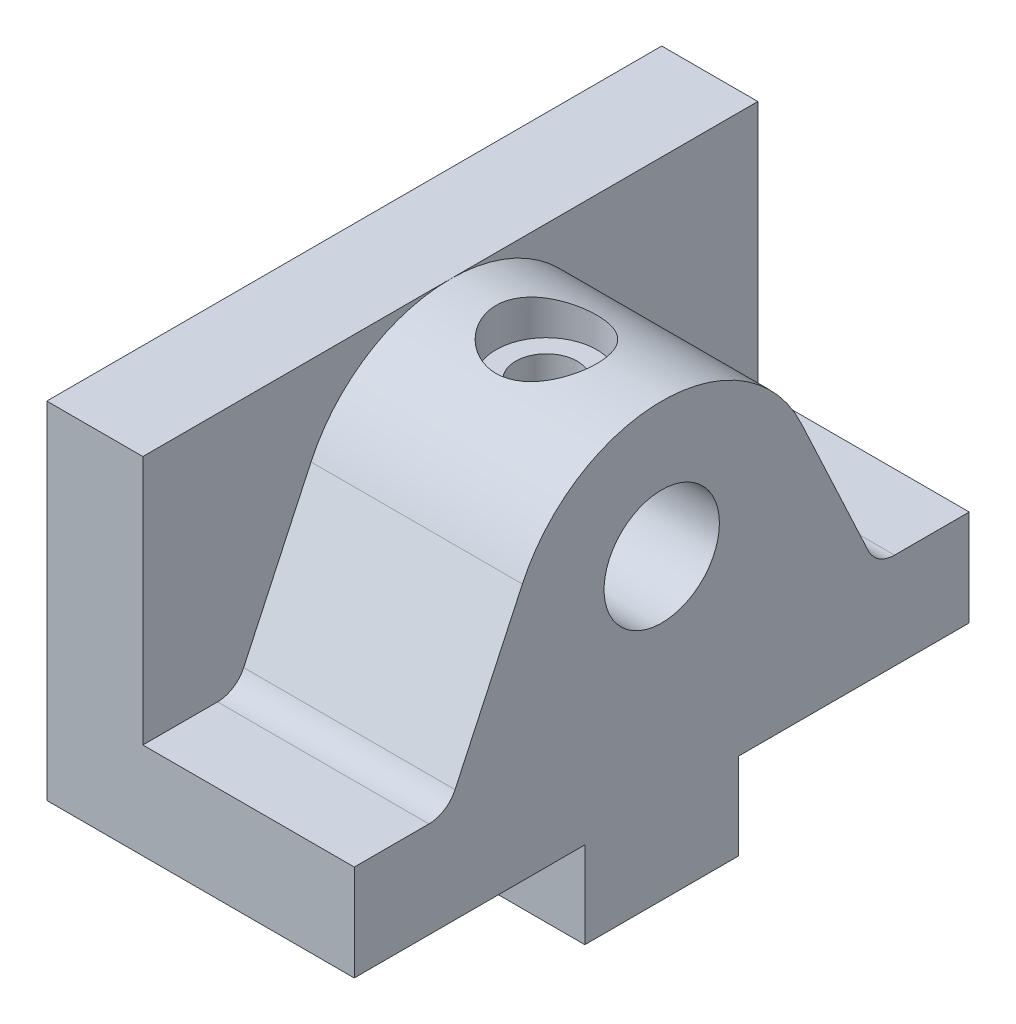
ISO-10303-21;
HEADER;
FILE_DESCRIPTION(('STEP AP214'),'2;1');
FILE_NAME('part.step','',(''),(''),'','','');
FILE_SCHEMA(('AUTOMOTIVE_DESIGN { 1 0 10303 214 1 1 1 1 }'));
ENDSEC;
DATA;
#1=APPLICATION_CONTEXT('core data for automotive mechanical design processes');
#2=APPLICATION_PROTOCOL_DEFINITION('international standard','automotive_design',2000,#1);
#3=PRODUCT_CONTEXT('',#1,'mechanical');
#4=PRODUCT('Part','Part','',(#3));
#5=PRODUCT_RELATED_PRODUCT_CATEGORY('part','',(#4));
#6=PRODUCT_DEFINITION_FORMATION('','',#4);
#7=PRODUCT_DEFINITION_CONTEXT('part definition',#1,'design');
#8=PRODUCT_DEFINITION('design','',#6,#7);
#9=PRODUCT_DEFINITION_SHAPE('','',#8);
#10=(LENGTH_UNIT() NAMED_UNIT(*) SI_UNIT(.MILLI.,.METRE.));
#11=(NAMED_UNIT(*) PLANE_ANGLE_UNIT() SI_UNIT($,.RADIAN.));
#12=(NAMED_UNIT(*) SI_UNIT($,.STERADIAN.) SOLID_ANGLE_UNIT());
#13=UNCERTAINTY_MEASURE_WITH_UNIT(LENGTH_MEASURE(1.E-05),#10,'distance_accuracy_value','');
#14=(GEOMETRIC_REPRESENTATION_CONTEXT(3) GLOBAL_UNCERTAINTY_ASSIGNED_CONTEXT((#13)) GLOBAL_UNIT_ASSIGNED_CONTEXT((#10,
#11,#12)) REPRESENTATION_CONTEXT('',''));
#15=CARTESIAN_POINT('',(0.,0.,0.));
#16=DIRECTION('',(0.,0.,1.));
#17=DIRECTION('',(1.,0.,0.));
#18=AXIS2_PLACEMENT_3D('',#15,#16,#17);
#19=CARTESIAN_POINT('',(32.,29.,0.));
#20=DIRECTION('',(-1.,0.,0.));
#21=DIRECTION('',(0.,0.,1.));
#22=AXIS2_PLACEMENT_3D('',#19,#20,#21);
#23=CYLINDRICAL_SURFACE('',#22,16.);
#24=CARTESIAN_POINT('',(20.,44.1141490001918,5.25));
#25=CARTESIAN_POINT('',(20.2862399912378,44.1141488277864,5.25000045848222));
#26=CARTESIAN_POINT('',(20.5724790069683,44.1223693526665,5.22651124120608));
#27=CARTESIAN_POINT('',(21.1364949318347,44.1541990111532,5.13347949667015));
#28=CARTESIAN_POINT('',(21.4142702153212,44.17781108179,5.06392817975404));
#29=CARTESIAN_POINT('',(21.9530997868456,44.2374676598123,4.88146368966989));
#30=CARTESIAN_POINT('',(22.2141849176572,44.2734883998512,4.76863336580666));
#31=CARTESIAN_POINT('',(22.7138017635542,44.3538695126229,4.50309502153799));
#32=CARTESIAN_POINT('',(22.9523287324993,44.3982316345059,4.35037863458794));
#33=CARTESIAN_POINT('',(23.4090988821987,44.4921827252159,4.00320337483453));
#34=CARTESIAN_POINT('',(23.6263621147882,44.5418989966284,3.80748934488802));
#35=CARTESIAN_POINT('',(24.0256483131268,44.6398787520157,3.38255491200123));
#36=CARTESIAN_POINT('',(24.2076658151615,44.6881420097698,3.15332932382409));
#37=CARTESIAN_POINT('',(24.5357088642128,44.7792471777439,2.66074424250728));
#38=CARTESIAN_POINT('',(24.6807121346096,44.8219218746451,2.3966702969027));
#39=CARTESIAN_POINT('',(24.9238550635939,44.8955450974396,1.84624013913086));
#40=CARTESIAN_POINT('',(25.0220069363935,44.9264966791274,1.55988975712002));
#41=CARTESIAN_POINT('',(25.165350860901,44.9722847158495,0.983306157529007));
#42=CARTESIAN_POINT('',(25.2122206628969,44.9876304536975,0.693531238138871));
#43=CARTESIAN_POINT('',(25.2569998107175,45.0022832276952,0.109850799627945));
#44=CARTESIAN_POINT('',(25.2549213939875,45.0015942726466,-0.184053668709217));
#45=CARTESIAN_POINT('',(25.2029373758687,44.9846028308919,-0.75579215660497));
#46=CARTESIAN_POINT('',(25.1548531678085,44.9688949663536,-1.03381232980338));
#47=CARTESIAN_POINT('',(25.0152285393295,44.9243733193102,-1.57759305294689));
#48=CARTESIAN_POINT('',(24.9236851984931,44.8955586560445,-1.84335277768305));
#49=CARTESIAN_POINT('',(24.6986504931013,44.827293412727,-2.35910715243038));
#50=CARTESIAN_POINT('',(24.5646321050164,44.7877101425793,-2.60885356318651));
#51=CARTESIAN_POINT('',(24.2588828999032,44.7020408419918,-3.08285821657604));
#52=CARTESIAN_POINT('',(24.0871418288635,44.6559530446716,-3.30710950376656));
#53=CARTESIAN_POINT('',(23.701599361394,44.5596588378374,-3.734600144692));
#54=CARTESIAN_POINT('',(23.4862342741626,44.5093604624126,-3.93641057040518));
#55=CARTESIAN_POINT('',(23.0242779746565,44.4121008511626,-4.30150362318824));
#56=CARTESIAN_POINT('',(22.7776822633624,44.365140097673,-4.46478068949822));
#57=CARTESIAN_POINT('',(22.2558627499943,44.2793792690122,-4.75006815697089));
#58=CARTESIAN_POINT('',(21.9802988274958,44.2406973142269,-4.87149464345703));
#59=CARTESIAN_POINT('',(21.4110500224792,44.1772455296613,-5.06574607230722));
#60=CARTESIAN_POINT('',(21.1173725057812,44.1524700857144,-5.13859062981242));
#61=CARTESIAN_POINT('',(20.5340362613495,44.1209007206699,-5.23074027258799));
#62=CARTESIAN_POINT('',(20.244766428925,44.1133656363251,-5.25225392788164));
#63=CARTESIAN_POINT('',(19.6667114449849,44.1150619799214,-5.24737291521556));
#64=CARTESIAN_POINT('',(19.3779262177028,44.124290482417,-5.22098660637017));
#65=CARTESIAN_POINT('',(18.8189455397546,44.1577370929003,-5.1230365564249));
#66=CARTESIAN_POINT('',(18.5484510805595,44.1814516414274,-5.05298895415494));
#67=CARTESIAN_POINT('',(18.0231029282508,44.2406495676964,-4.87151396022818));
#68=CARTESIAN_POINT('',(17.7682519619801,44.276134990374,-4.76007937807277));
#69=CARTESIAN_POINT('',(17.2726831888759,44.3562378094073,-4.4950678329135));
#70=CARTESIAN_POINT('',(17.0326473205719,44.4011039403221,-4.34029284144107));
#71=CARTESIAN_POINT('',(16.5811543923619,44.4944220870633,-3.99436200821794));
#72=CARTESIAN_POINT('',(16.3697055340331,44.5428751258249,-3.80319576358278));
#73=CARTESIAN_POINT('',(15.9712565423561,44.6406265983864,-3.37937404629902));
#74=CARTESIAN_POINT('',(15.785845431176,44.6898599940428,-3.14520539148217));
#75=CARTESIAN_POINT('',(15.4568575354208,44.7814007265402,-2.64787225955551));
#76=CARTESIAN_POINT('',(15.313279136686,44.8237083305925,-2.38470890177728));
#77=CARTESIAN_POINT('',(15.0733675387909,44.8964203296042,-1.83825718078448));
#78=CARTESIAN_POINT('',(14.9767161192597,44.9269046084335,-1.55511971833816));
#79=CARTESIAN_POINT('',(14.8327793374282,44.9728819568421,-0.975417221298536));
#80=CARTESIAN_POINT('',(14.7854767681403,44.9883802516057,-0.678856904652153));
#81=CARTESIAN_POINT('',(14.743091187699,45.0022572144684,-0.0952843038103975));
#82=CARTESIAN_POINT('',(14.7457235870104,45.0013848804167,0.191546080214887));
#83=CARTESIAN_POINT('',(14.7975259536483,44.9844499558129,0.760488495422725));
#84=CARTESIAN_POINT('',(14.8466923409802,44.9683885338013,1.04260088787496));
#85=CARTESIAN_POINT('',(14.9886659534031,44.9231454278809,1.58990287320105));
#86=CARTESIAN_POINT('',(15.0808080785038,44.8941639883583,1.85528272491532));
#87=CARTESIAN_POINT('',(15.3055060255068,44.8260654643129,2.3669256435968));
#88=CARTESIAN_POINT('',(15.4380690760517,44.7869465670541,2.61318528132536));
#89=CARTESIAN_POINT('',(15.7453792565591,44.7008535913589,3.08931579551705));
#90=CARTESIAN_POINT('',(15.921480238379,44.6536463406316,3.31827016090591));
#91=CARTESIAN_POINT('',(16.3085430909937,44.5572898435722,3.74412763044356));
#92=CARTESIAN_POINT('',(16.5195159083277,44.5081399911404,3.94102063163231));
#93=CARTESIAN_POINT('',(16.9798217267081,44.4112479247201,4.30467545422578));
#94=CARTESIAN_POINT('',(17.2302985304081,44.3636280615811,4.47002653373343));
#95=CARTESIAN_POINT('',(17.7569564445767,44.2774817855947,4.75615292210674));
#96=CARTESIAN_POINT('',(18.0331298337881,44.2389526534081,4.87694156718453));
#97=CARTESIAN_POINT('',(18.5876934980254,44.1776313271151,5.06445895408005));
#98=CARTESIAN_POINT('',(18.8651109075113,44.1540847103715,5.13381490399418));
#99=CARTESIAN_POINT('',(19.4283543345849,44.1223460701014,5.22657790488174));
#100=CARTESIAN_POINT('',(19.7141776536237,44.1141491723457,5.24999954218674));
#101=CARTESIAN_POINT('',(20.,44.1141490001918,5.25));
#102=B_SPLINE_CURVE_WITH_KNOTS('',3,(#24,#25,#26,#27,#28,#29,#30,#31,#32,#33,#34,#35,#36,#37,
#38,#39,#40,#41,#42,#43,#44,#45,#46,#47,#48,#49,#50,#51,#52,#53,#54,#55,#56,#57,#58,#59,#60,#61,
#62,#63,#64,#65,#66,#67,#68,#69,#70,#71,#72,#73,#74,#75,#76,#77,#78,#79,#80,#81,#82,#83,#84,#85,
#86,#87,#88,#89,#90,#91,#92,#93,#94,#95,#96,#97,#98,#99,#100,#101),.UNSPECIFIED.,.T.,.F.,(4,2,2,
2,2,2,2,2,2,2,2,2,2,2,2,2,2,2,2,2,2,2,2,2,2,2,2,2,2,2,2,2,2,2,2,2,2,2,4),(0.,0.857662200731018,
1.71548810934704,2.57168000579665,3.42805164244489,4.31388065648357,5.19984688002419,
6.10813339010178,7.0161829793607,7.89354360994142,8.7706848956931,9.61447728120185,
10.458326376885,11.3130851674632,12.168076591998,13.0621480471497,13.9563484472153,
14.8625629319768,15.7684113072809,16.6345203385931,17.5004782380919,18.3379232251314,
19.1755137764532,20.0390388124152,20.9028110692555,21.8066498220125,22.7104536945702,
23.6080400035178,24.5053132368085,25.3616382800044,26.2178974489868,27.0613236438353,
27.9049007606583,28.7790284198901,29.6534309974958,30.5607004111564,31.467698085371,
32.324380976572,33.1807917860858),.UNSPECIFIED.);
#103=CARTESIAN_POINT('',(20.,44.1141490001918,5.25));
#104=VERTEX_POINT('',#103);
#105=EDGE_CURVE('E48',#104,#104,#102,.T.);
#106=ORIENTED_EDGE('',*,*,#105,.F.);
#107=EDGE_LOOP('',(#106));
#108=FACE_BOUND('',#107,.T.);
#109=CARTESIAN_POINT('',(10.,29.,0.));
#110=DIRECTION('',(1.,0.,0.));
#111=DIRECTION('',(0.,0.,-1.));
#112=AXIS2_PLACEMENT_3D('',#109,#110,#111);
#113=CIRCLE('',#112,16.);
#114=CARTESIAN_POINT('',(10.,45.,0.));
#115=VERTEX_POINT('',#114);
#116=CARTESIAN_POINT('',(10.,35.7618921878511,-14.5009245925864));
#117=VERTEX_POINT('',#116);
#118=EDGE_CURVE('E267',#115,#117,#113,.F.);
#119=ORIENTED_EDGE('',*,*,#118,.F.);
#120=CARTESIAN_POINT('',(10.,29.,0.));
#121=DIRECTION('',(1.,0.,0.));
#122=DIRECTION('',(0.,0.,-1.));
#123=AXIS2_PLACEMENT_3D('',#120,#121,#122);
#124=CIRCLE('',#123,16.);
#125=CARTESIAN_POINT('',(10.,35.7618921878511,14.5009245925864));
#126=VERTEX_POINT('',#125);
#127=EDGE_CURVE('E270',#126,#115,#124,.F.);
#128=ORIENTED_EDGE('',*,*,#127,.F.);
#129=DIRECTION('',(-1.,0.,0.));
#130=VECTOR('',#129,1.);
#131=CARTESIAN_POINT('',(32.,35.7618921878511,14.5009245925864));
#132=LINE('',#131,#130);
#133=CARTESIAN_POINT('',(32.,35.7618921878511,14.5009245925864));
#134=VERTEX_POINT('',#133);
#135=EDGE_CURVE('E56',#134,#126,#132,.T.);
#136=ORIENTED_EDGE('',*,*,#135,.F.);
#137=CARTESIAN_POINT('',(32.,29.,0.));
#138=DIRECTION('',(1.,0.,0.));
#139=DIRECTION('',(0.,0.,-1.));
#140=AXIS2_PLACEMENT_3D('',#137,#138,#139);
#141=CIRCLE('',#140,16.);
#142=CARTESIAN_POINT('',(32.,35.7618921878511,-14.5009245925864));
#143=VERTEX_POINT('',#142);
#144=EDGE_CURVE('E158',#134,#143,#141,.F.);
#145=ORIENTED_EDGE('',*,*,#144,.T.);
#146=DIRECTION('',(-1.,0.,0.));
#147=VECTOR('',#146,1.);
#148=CARTESIAN_POINT('',(32.,35.7618921878511,-14.5009245925864));
#149=LINE('',#148,#147);
#150=EDGE_CURVE('E144',#143,#117,#149,.T.);
#151=ORIENTED_EDGE('',*,*,#150,.T.);
#152=EDGE_LOOP('',(#119,#128,#136,#145,#151));
#153=FACE_BOUND('',#152,.T.);
#154=ADVANCED_FACE('F38',(#108,#153),#23,.T.);
#155=CARTESIAN_POINT('',(32.,11.9414718473963,25.6085690178115));
#156=DIRECTION('',(0.,0.422618261740697,0.906307787036651));
#157=DIRECTION('',(0.,-0.906307787036651,0.422618261740697));
#158=AXIS2_PLACEMENT_3D('',#155,#156,#157);
#159=PLANE('',#158);
#160=DIRECTION('',(0.,0.906307787036651,-0.422618261740697));
#161=VECTOR('',#160,1.);
#162=CARTESIAN_POINT('',(10.,11.9414718473963,25.6085690178115));
#163=LINE('',#162,#161);
#164=CARTESIAN_POINT('',(10.,20.7321452147779,21.5094107062623));
#165=VERTEX_POINT('',#164);
#166=EDGE_CURVE('E288',#165,#126,#163,.T.);
#167=ORIENTED_EDGE('',*,*,#166,.F.);
#168=DIRECTION('',(-1.,0.,0.));
#169=VECTOR('',#168,1.);
#170=CARTESIAN_POINT('',(32.,20.7321452147779,21.5094107062623));
#171=LINE('',#170,#169);
#172=CARTESIAN_POINT('',(32.,20.7321452147779,21.5094107062623));
#173=VERTEX_POINT('',#172);
#174=EDGE_CURVE('E93',#173,#165,#171,.T.);
#175=ORIENTED_EDGE('',*,*,#174,.F.);
#176=DIRECTION('',(0.,0.906307787036651,-0.422618261740697));
#177=VECTOR('',#176,1.);
#178=CARTESIAN_POINT('',(32.,11.9414718473963,25.6085690178115));
#179=LINE('',#178,#177);
#180=EDGE_CURVE('E310',#173,#134,#179,.T.);
#181=ORIENTED_EDGE('',*,*,#180,.T.);
#182=ORIENTED_EDGE('',*,*,#135,.T.);
#183=EDGE_LOOP('',(#167,#175,#181,#182));
#184=FACE_BOUND('',#183,.T.);
#185=ADVANCED_FACE('F257',(#184),#159,.T.);
#186=CARTESIAN_POINT('',(32.,22.,24.2283340673723));
#187=DIRECTION('',(-1.,0.,0.));
#188=DIRECTION('',(0.,0.,1.));
#189=AXIS2_PLACEMENT_3D('',#186,#187,#188);
#190=CYLINDRICAL_SURFACE('',#189,3.);
#191=ORIENTED_EDGE('',*,*,#174,.T.);
#192=CARTESIAN_POINT('',(10.,22.,24.2283340673723));
#193=DIRECTION('',(1.,0.,0.));
#194=DIRECTION('',(0.,0.,-1.));
#195=AXIS2_PLACEMENT_3D('',#192,#193,#194);
#196=CIRCLE('',#195,3.);
#197=CARTESIAN_POINT('',(10.,19.,24.2283340673723));
#198=VERTEX_POINT('',#197);
#199=EDGE_CURVE('E306',#165,#198,#196,.F.);
#200=ORIENTED_EDGE('',*,*,#199,.T.);
#201=DIRECTION('',(-1.,0.,0.));
#202=VECTOR('',#201,1.);
#203=CARTESIAN_POINT('',(32.,19.,24.2283340673723));
#204=LINE('',#203,#202);
#205=CARTESIAN_POINT('',(32.,19.,24.2283340673723));
#206=VERTEX_POINT('',#205);
#207=EDGE_CURVE('E204',#206,#198,#204,.T.);
#208=ORIENTED_EDGE('',*,*,#207,.F.);
#209=CARTESIAN_POINT('',(32.,22.,24.2283340673723));
#210=DIRECTION('',(1.,0.,0.));
#211=DIRECTION('',(0.,0.,-1.));
#212=AXIS2_PLACEMENT_3D('',#209,#210,#211);
#213=CIRCLE('',#212,3.);
#214=EDGE_CURVE('E312',#173,#206,#213,.F.);
#215=ORIENTED_EDGE('',*,*,#214,.F.);
#216=EDGE_LOOP('',(#191,#200,#208,#215));
#217=FACE_BOUND('',#216,.T.);
#218=ADVANCED_FACE('F262',(#217),#190,.F.);
#219=CARTESIAN_POINT('',(32.,19.,0.));
#220=DIRECTION('',(0.,1.,0.));
#221=DIRECTION('',(0.,0.,1.));
#222=AXIS2_PLACEMENT_3D('',#219,#220,#221);
#223=PLANE('',#222);
#224=DIRECTION('',(0.,0.,-1.));
#225=VECTOR('',#224,1.);
#226=CARTESIAN_POINT('',(10.,19.,0.));
#227=LINE('',#226,#225);
#228=CARTESIAN_POINT('',(10.,19.,32.));
#229=VERTEX_POINT('',#228);
#230=EDGE_CURVE('E299',#229,#198,#227,.T.);
#231=ORIENTED_EDGE('',*,*,#230,.F.);
#232=DIRECTION('',(-1.,0.,0.));
#233=VECTOR('',#232,1.);
#234=CARTESIAN_POINT('',(32.,19.,32.));
#235=LINE('',#234,#233);
#236=CARTESIAN_POINT('',(32.,19.,32.));
#237=VERTEX_POINT('',#236);
#238=EDGE_CURVE('E201',#237,#229,#235,.T.);
#239=ORIENTED_EDGE('',*,*,#238,.F.);
#240=DIRECTION('',(0.,0.,-1.));
#241=VECTOR('',#240,1.);
#242=CARTESIAN_POINT('',(32.,19.,0.));
#243=LINE('',#242,#241);
#244=EDGE_CURVE('E314',#237,#206,#243,.T.);
#245=ORIENTED_EDGE('',*,*,#244,.T.);
#246=ORIENTED_EDGE('',*,*,#207,.T.);
#247=EDGE_LOOP('',(#231,#239,#245,#246));
#248=FACE_BOUND('',#247,.T.);
#249=ADVANCED_FACE('F366',(#248),#223,.T.);
#250=CARTESIAN_POINT('',(32.,0.,32.));
#251=DIRECTION('',(0.,0.,1.));
#252=DIRECTION('',(1.,0.,0.));
#253=AXIS2_PLACEMENT_3D('',#250,#251,#252);
#254=PLANE('',#253);
#255=DIRECTION('',(0.,1.,0.));
#256=VECTOR('',#255,1.);
#257=CARTESIAN_POINT('',(0.,0.,32.));
#258=LINE('',#257,#256);
#259=CARTESIAN_POINT('',(0.,9.,32.));
#260=VERTEX_POINT('',#259);
#261=CARTESIAN_POINT('',(0.,45.,32.));
#262=VERTEX_POINT('',#261);
#263=EDGE_CURVE('E163',#260,#262,#258,.T.);
#264=ORIENTED_EDGE('',*,*,#263,.F.);
#265=DIRECTION('',(-1.,0.,0.));
#266=VECTOR('',#265,1.);
#267=CARTESIAN_POINT('',(32.,9.,32.));
#268=LINE('',#267,#266);
#269=CARTESIAN_POINT('',(32.,9.,32.));
#270=VERTEX_POINT('',#269);
#271=EDGE_CURVE('E199',#270,#260,#268,.T.);
#272=ORIENTED_EDGE('',*,*,#271,.F.);
#273=DIRECTION('',(0.,1.,0.));
#274=VECTOR('',#273,1.);
#275=CARTESIAN_POINT('',(32.,0.,32.));
#276=LINE('',#275,#274);
#277=EDGE_CURVE('E317',#270,#237,#276,.T.);
#278=ORIENTED_EDGE('',*,*,#277,.T.);
#279=ORIENTED_EDGE('',*,*,#238,.T.);
#280=DIRECTION('',(0.,1.,0.));
#281=VECTOR('',#280,1.);
#282=CARTESIAN_POINT('',(10.,0.,32.));
#283=LINE('',#282,#281);
#284=CARTESIAN_POINT('',(10.,45.,32.));
#285=VERTEX_POINT('',#284);
#286=EDGE_CURVE('E297',#229,#285,#283,.T.);
#287=ORIENTED_EDGE('',*,*,#286,.T.);
#288=DIRECTION('',(-1.,0.,0.));
#289=VECTOR('',#288,1.);
#290=CARTESIAN_POINT('',(10.,45.,32.));
#291=LINE('',#290,#289);
#292=EDGE_CURVE('E167',#285,#262,#291,.T.);
#293=ORIENTED_EDGE('',*,*,#292,.T.);
#294=EDGE_LOOP('',(#264,#272,#278,#279,#287,#293));
#295=FACE_BOUND('',#294,.T.);
#296=ADVANCED_FACE('F372',(#295),#254,.T.);
#297=CARTESIAN_POINT('',(32.,9.,0.));
#298=DIRECTION('',(0.,-1.,0.));
#299=DIRECTION('',(0.,0.,-1.));
#300=AXIS2_PLACEMENT_3D('',#297,#298,#299);
#301=PLANE('',#300);
#302=DIRECTION('',(0.,0.,1.));
#303=VECTOR('',#302,1.);
#304=CARTESIAN_POINT('',(0.,9.,0.));
#305=LINE('',#304,#303);
#306=CARTESIAN_POINT('',(0.,9.,8.));
#307=VERTEX_POINT('',#306);
#308=EDGE_CURVE('E166',#307,#260,#305,.T.);
#309=ORIENTED_EDGE('',*,*,#308,.F.);
#310=DIRECTION('',(-1.,0.,0.));
#311=VECTOR('',#310,1.);
#312=CARTESIAN_POINT('',(32.,9.,8.));
#313=LINE('',#312,#311);
#314=CARTESIAN_POINT('',(32.,9.,8.));
#315=VERTEX_POINT('',#314);
#316=EDGE_CURVE('E197',#315,#307,#313,.T.);
#317=ORIENTED_EDGE('',*,*,#316,.F.);
#318=DIRECTION('',(0.,0.,1.));
#319=VECTOR('',#318,1.);
#320=CARTESIAN_POINT('',(32.,9.,0.));
#321=LINE('',#320,#319);
#322=EDGE_CURVE('E320',#315,#270,#321,.T.);
#323=ORIENTED_EDGE('',*,*,#322,.T.);
#324=ORIENTED_EDGE('',*,*,#271,.T.);
#325=EDGE_LOOP('',(#309,#317,#323,#324));
#326=FACE_BOUND('',#325,.T.);
#327=ADVANCED_FACE('F375',(#326),#301,.T.);
#328=CARTESIAN_POINT('',(32.,0.,8.));
#329=DIRECTION('',(0.,0.,1.));
#330=DIRECTION('',(1.,0.,0.));
#331=AXIS2_PLACEMENT_3D('',#328,#329,#330);
#332=PLANE('',#331);
#333=DIRECTION('',(0.,1.,0.));
#334=VECTOR('',#333,1.);
#335=CARTESIAN_POINT('',(0.,0.,8.));
#336=LINE('',#335,#334);
#337=CARTESIAN_POINT('',(0.,0.,8.));
#338=VERTEX_POINT('',#337);
#339=EDGE_CURVE('E170',#338,#307,#336,.T.);
#340=ORIENTED_EDGE('',*,*,#339,.F.);
#341=DIRECTION('',(-1.,0.,0.));
#342=VECTOR('',#341,1.);
#343=CARTESIAN_POINT('',(32.,0.,8.));
#344=LINE('',#343,#342);
#345=CARTESIAN_POINT('',(32.,0.,8.));
#346=VERTEX_POINT('',#345);
#347=EDGE_CURVE('E195',#346,#338,#344,.T.);
#348=ORIENTED_EDGE('',*,*,#347,.F.);
#349=DIRECTION('',(0.,1.,0.));
#350=VECTOR('',#349,1.);
#351=CARTESIAN_POINT('',(32.,0.,8.));
#352=LINE('',#351,#350);
#353=EDGE_CURVE('E323',#346,#315,#352,.T.);
#354=ORIENTED_EDGE('',*,*,#353,.T.);
#355=ORIENTED_EDGE('',*,*,#316,.T.);
#356=EDGE_LOOP('',(#340,#348,#354,#355));
#357=FACE_BOUND('',#356,.T.);
#358=ADVANCED_FACE('F379',(#357),#332,.T.);
#359=CARTESIAN_POINT('',(32.,0.,0.));
#360=DIRECTION('',(0.,1.,0.));
#361=DIRECTION('',(0.,0.,1.));
#362=AXIS2_PLACEMENT_3D('',#359,#360,#361);
#363=PLANE('',#362);
#364=CARTESIAN_POINT('',(24.,0.,0.));
#365=DIRECTION('',(0.,-1.,0.));
#366=DIRECTION('',(0.,0.,-1.));
#367=AXIS2_PLACEMENT_3D('',#364,#365,#366);
#368=CIRCLE('',#367,2.5);
#369=CARTESIAN_POINT('',(24.,0.,-2.50000000000001));
#370=VERTEX_POINT('',#369);
#371=EDGE_CURVE('E420',#370,#370,#368,.T.);
#372=ORIENTED_EDGE('',*,*,#371,.F.);
#373=EDGE_LOOP('',(#372));
#374=FACE_BOUND('',#373,.T.);
#375=CARTESIAN_POINT('',(8.,0.,0.));
#376=DIRECTION('',(0.,-1.,0.));
#377=DIRECTION('',(0.,0.,-1.));
#378=AXIS2_PLACEMENT_3D('',#375,#376,#377);
#379=CIRCLE('',#378,2.5);
#380=CARTESIAN_POINT('',(8.,0.,-2.50000000000001));
#381=VERTEX_POINT('',#380);
#382=EDGE_CURVE('E419',#381,#381,#379,.T.);
#383=ORIENTED_EDGE('',*,*,#382,.F.);
#384=EDGE_LOOP('',(#383));
#385=FACE_BOUND('',#384,.T.);
#386=DIRECTION('',(0.,0.,-1.));
#387=VECTOR('',#386,1.);
#388=CARTESIAN_POINT('',(0.,0.,0.));
#389=LINE('',#388,#387);
#390=CARTESIAN_POINT('',(0.,0.,-8.));
#391=VERTEX_POINT('',#390);
#392=EDGE_CURVE('E173',#338,#391,#389,.T.);
#393=ORIENTED_EDGE('',*,*,#392,.T.);
#394=DIRECTION('',(-1.,0.,0.));
#395=VECTOR('',#394,1.);
#396=CARTESIAN_POINT('',(32.,0.,-8.));
#397=LINE('',#396,#395);
#398=CARTESIAN_POINT('',(32.,0.,-8.));
#399=VERTEX_POINT('',#398);
#400=EDGE_CURVE('E192',#399,#391,#397,.T.);
#401=ORIENTED_EDGE('',*,*,#400,.F.);
#402=DIRECTION('',(0.,0.,-1.));
#403=VECTOR('',#402,1.);
#404=CARTESIAN_POINT('',(32.,0.,0.));
#405=LINE('',#404,#403);
#406=EDGE_CURVE('E326',#346,#399,#405,.T.);
#407=ORIENTED_EDGE('',*,*,#406,.F.);
#408=ORIENTED_EDGE('',*,*,#347,.T.);
#409=EDGE_LOOP('',(#393,#401,#407,#408));
#410=FACE_BOUND('',#409,.T.);
#411=ADVANCED_FACE('F384',(#374,#385,#410),#363,.F.);
#412=CARTESIAN_POINT('',(32.,0.,-8.));
#413=DIRECTION('',(0.,0.,1.));
#414=DIRECTION('',(1.,0.,0.));
#415=AXIS2_PLACEMENT_3D('',#412,#413,#414);
#416=PLANE('',#415);
#417=DIRECTION('',(0.,1.,0.));
#418=VECTOR('',#417,1.);
#419=CARTESIAN_POINT('',(0.,0.,-8.));
#420=LINE('',#419,#418);
#421=CARTESIAN_POINT('',(0.,9.,-8.));
#422=VERTEX_POINT('',#421);
#423=EDGE_CURVE('E176',#391,#422,#420,.T.);
#424=ORIENTED_EDGE('',*,*,#423,.T.);
#425=DIRECTION('',(-1.,0.,0.));
#426=VECTOR('',#425,1.);
#427=CARTESIAN_POINT('',(32.,9.,-8.));
#428=LINE('',#427,#426);
#429=CARTESIAN_POINT('',(32.,9.,-8.));
#430=VERTEX_POINT('',#429);
#431=EDGE_CURVE('E190',#430,#422,#428,.T.);
#432=ORIENTED_EDGE('',*,*,#431,.F.);
#433=DIRECTION('',(0.,1.,0.));
#434=VECTOR('',#433,1.);
#435=CARTESIAN_POINT('',(32.,0.,-8.));
#436=LINE('',#435,#434);
#437=EDGE_CURVE('E329',#399,#430,#436,.T.);
#438=ORIENTED_EDGE('',*,*,#437,.F.);
#439=ORIENTED_EDGE('',*,*,#400,.T.);
#440=EDGE_LOOP('',(#424,#432,#438,#439));
#441=FACE_BOUND('',#440,.T.);
#442=ADVANCED_FACE('F387',(#441),#416,.F.);
#443=CARTESIAN_POINT('',(32.,9.,0.));
#444=DIRECTION('',(0.,1.,0.));
#445=DIRECTION('',(0.,0.,1.));
#446=AXIS2_PLACEMENT_3D('',#443,#444,#445);
#447=PLANE('',#446);
#448=DIRECTION('',(0.,0.,-1.));
#449=VECTOR('',#448,1.);
#450=CARTESIAN_POINT('',(0.,9.,0.));
#451=LINE('',#450,#449);
#452=CARTESIAN_POINT('',(0.,9.,-32.));
#453=VERTEX_POINT('',#452);
#454=EDGE_CURVE('E80',#422,#453,#451,.T.);
#455=ORIENTED_EDGE('',*,*,#454,.T.);
#456=DIRECTION('',(-1.,0.,0.));
#457=VECTOR('',#456,1.);
#458=CARTESIAN_POINT('',(32.,9.,-32.));
#459=LINE('',#458,#457);
#460=CARTESIAN_POINT('',(32.,9.,-32.));
#461=VERTEX_POINT('',#460);
#462=EDGE_CURVE('E188',#461,#453,#459,.T.);
#463=ORIENTED_EDGE('',*,*,#462,.F.);
#464=DIRECTION('',(0.,0.,-1.));
#465=VECTOR('',#464,1.);
#466=CARTESIAN_POINT('',(32.,9.,0.));
#467=LINE('',#466,#465);
#468=EDGE_CURVE('E332',#430,#461,#467,.T.);
#469=ORIENTED_EDGE('',*,*,#468,.F.);
#470=ORIENTED_EDGE('',*,*,#431,.T.);
#471=EDGE_LOOP('',(#455,#463,#469,#470));
#472=FACE_BOUND('',#471,.T.);
#473=ADVANCED_FACE('F389',(#472),#447,.F.);
#474=CARTESIAN_POINT('',(32.,0.,-32.));
#475=DIRECTION('',(0.,0.,1.));
#476=DIRECTION('',(1.,0.,0.));
#477=AXIS2_PLACEMENT_3D('',#474,#475,#476);
#478=PLANE('',#477);
#479=DIRECTION('',(0.,1.,0.));
#480=VECTOR('',#479,1.);
#481=CARTESIAN_POINT('',(0.,0.,-32.));
#482=LINE('',#481,#480);
#483=CARTESIAN_POINT('',(0.,45.,-32.));
#484=VERTEX_POINT('',#483);
#485=EDGE_CURVE('E85',#453,#484,#482,.T.);
#486=ORIENTED_EDGE('',*,*,#485,.T.);
#487=DIRECTION('',(-1.,0.,0.));
#488=VECTOR('',#487,1.);
#489=CARTESIAN_POINT('',(10.,45.,-32.));
#490=LINE('',#489,#488);
#491=CARTESIAN_POINT('',(10.,45.,-32.));
#492=VERTEX_POINT('',#491);
#493=EDGE_CURVE('E390',#492,#484,#490,.T.);
#494=ORIENTED_EDGE('',*,*,#493,.F.);
#495=DIRECTION('',(0.,1.,0.));
#496=VECTOR('',#495,1.);
#497=CARTESIAN_POINT('',(10.,0.,-32.));
#498=LINE('',#497,#496);
#499=CARTESIAN_POINT('',(10.,19.,-32.));
#500=VERTEX_POINT('',#499);
#501=EDGE_CURVE('E278',#500,#492,#498,.T.);
#502=ORIENTED_EDGE('',*,*,#501,.F.);
#503=DIRECTION('',(-1.,0.,0.));
#504=VECTOR('',#503,1.);
#505=CARTESIAN_POINT('',(32.,19.,-32.));
#506=LINE('',#505,#504);
#507=CARTESIAN_POINT('',(32.,19.,-32.));
#508=VERTEX_POINT('',#507);
#509=EDGE_CURVE('E185',#508,#500,#506,.T.);
#510=ORIENTED_EDGE('',*,*,#509,.F.);
#511=DIRECTION('',(0.,1.,0.));
#512=VECTOR('',#511,1.);
#513=CARTESIAN_POINT('',(32.,0.,-32.));
#514=LINE('',#513,#512);
#515=EDGE_CURVE('E335',#461,#508,#514,.T.);
#516=ORIENTED_EDGE('',*,*,#515,.F.);
#517=ORIENTED_EDGE('',*,*,#462,.T.);
#518=EDGE_LOOP('',(#486,#494,#502,#510,#516,#517));
#519=FACE_BOUND('',#518,.T.);
#520=ADVANCED_FACE('F340',(#519),#478,.F.);
#521=CARTESIAN_POINT('',(32.,19.,0.));
#522=DIRECTION('',(0.,-1.,0.));
#523=DIRECTION('',(0.,0.,-1.));
#524=AXIS2_PLACEMENT_3D('',#521,#522,#523);
#525=PLANE('',#524);
#526=ORIENTED_EDGE('',*,*,#509,.T.);
#527=DIRECTION('',(0.,0.,1.));
#528=VECTOR('',#527,1.);
#529=CARTESIAN_POINT('',(10.,19.,0.));
#530=LINE('',#529,#528);
#531=CARTESIAN_POINT('',(10.,19.,-24.2283340673723));
#532=VERTEX_POINT('',#531);
#533=EDGE_CURVE('E348',#500,#532,#530,.T.);
#534=ORIENTED_EDGE('',*,*,#533,.T.);
#535=DIRECTION('',(-1.,0.,0.));
#536=VECTOR('',#535,1.);
#537=CARTESIAN_POINT('',(32.,19.,-24.2283340673723));
#538=LINE('',#537,#536);
#539=CARTESIAN_POINT('',(32.,19.,-24.2283340673723));
#540=VERTEX_POINT('',#539);
#541=EDGE_CURVE('E143',#540,#532,#538,.T.);
#542=ORIENTED_EDGE('',*,*,#541,.F.);
#543=DIRECTION('',(0.,0.,1.));
#544=VECTOR('',#543,1.);
#545=CARTESIAN_POINT('',(32.,19.,0.));
#546=LINE('',#545,#544);
#547=EDGE_CURVE('E153',#508,#540,#546,.T.);
#548=ORIENTED_EDGE('',*,*,#547,.F.);
#549=EDGE_LOOP('',(#526,#534,#542,#548));
#550=FACE_BOUND('',#549,.T.);
#551=ADVANCED_FACE('F346',(#550),#525,.F.);
#552=CARTESIAN_POINT('',(32.,22.,-24.2283340673723));
#553=DIRECTION('',(-1.,0.,0.));
#554=DIRECTION('',(0.,0.,1.));
#555=AXIS2_PLACEMENT_3D('',#552,#553,#554);
#556=CYLINDRICAL_SURFACE('',#555,3.);
#557=CARTESIAN_POINT('',(10.,22.,-24.2283340673723));
#558=DIRECTION('',(1.,0.,0.));
#559=DIRECTION('',(0.,0.,-1.));
#560=AXIS2_PLACEMENT_3D('',#557,#558,#559);
#561=CIRCLE('',#560,3.);
#562=CARTESIAN_POINT('',(10.,20.7321452147779,-21.5094107062623));
#563=VERTEX_POINT('',#562);
#564=EDGE_CURVE('E139',#563,#532,#561,.T.);
#565=ORIENTED_EDGE('',*,*,#564,.F.);
#566=DIRECTION('',(-1.,0.,0.));
#567=VECTOR('',#566,1.);
#568=CARTESIAN_POINT('',(32.,20.7321452147779,-21.5094107062623));
#569=LINE('',#568,#567);
#570=CARTESIAN_POINT('',(32.,20.7321452147779,-21.5094107062623));
#571=VERTEX_POINT('',#570);
#572=EDGE_CURVE('E132',#571,#563,#569,.T.);
#573=ORIENTED_EDGE('',*,*,#572,.F.);
#574=CARTESIAN_POINT('',(32.,22.,-24.2283340673723));
#575=DIRECTION('',(1.,0.,0.));
#576=DIRECTION('',(0.,0.,-1.));
#577=AXIS2_PLACEMENT_3D('',#574,#575,#576);
#578=CIRCLE('',#577,3.);
#579=EDGE_CURVE('E136',#571,#540,#578,.T.);
#580=ORIENTED_EDGE('',*,*,#579,.T.);
#581=ORIENTED_EDGE('',*,*,#541,.T.);
#582=EDGE_LOOP('',(#565,#573,#580,#581));
#583=FACE_BOUND('',#582,.T.);
#584=ADVANCED_FACE('F134',(#583),#556,.F.);
#585=CARTESIAN_POINT('',(32.,11.9414718473963,-25.6085690178115));
#586=DIRECTION('',(0.,0.422618261740697,-0.906307787036651));
#587=DIRECTION('',(0.,0.906307787036651,0.422618261740697));
#588=AXIS2_PLACEMENT_3D('',#585,#586,#587);
#589=PLANE('',#588);
#590=DIRECTION('',(0.,-0.906307787036651,-0.422618261740697));
#591=VECTOR('',#590,1.);
#592=CARTESIAN_POINT('',(10.,11.9414718473963,-25.6085690178115));
#593=LINE('',#592,#591);
#594=EDGE_CURVE('E392',#117,#563,#593,.T.);
#595=ORIENTED_EDGE('',*,*,#594,.F.);
#596=ORIENTED_EDGE('',*,*,#150,.F.);
#597=DIRECTION('',(0.,-0.906307787036651,-0.422618261740697));
#598=VECTOR('',#597,1.);
#599=CARTESIAN_POINT('',(32.,11.9414718473963,-25.6085690178115));
#600=LINE('',#599,#598);
#601=EDGE_CURVE('E151',#143,#571,#600,.T.);
#602=ORIENTED_EDGE('',*,*,#601,.T.);
#603=ORIENTED_EDGE('',*,*,#572,.T.);
#604=EDGE_LOOP('',(#595,#596,#602,#603));
#605=FACE_BOUND('',#604,.T.);
#606=ADVANCED_FACE('F156',(#605),#589,.T.);
#607=CARTESIAN_POINT('',(32.,31.,0.));
#608=DIRECTION('',(-1.,0.,0.));
#609=DIRECTION('',(0.,0.,1.));
#610=AXIS2_PLACEMENT_3D('',#607,#608,#609);
#611=CYLINDRICAL_SURFACE('',#610,6.);
#612=CARTESIAN_POINT('',(10.,31.,0.));
#613=DIRECTION('',(1.,0.,0.));
#614=DIRECTION('',(0.,0.,-1.));
#615=AXIS2_PLACEMENT_3D('',#612,#613,#614);
#616=CIRCLE('',#615,6.);
#617=CARTESIAN_POINT('',(10.,31.,-6.));
#618=VERTEX_POINT('',#617);
#619=EDGE_CURVE('E11',#618,#618,#616,.T.);
#620=ORIENTED_EDGE('',*,*,#619,.F.);
#621=EDGE_LOOP('',(#620));
#622=FACE_BOUND('',#621,.T.);
#623=CARTESIAN_POINT('',(20.,36.0754310161798,3.2));
#624=CARTESIAN_POINT('',(19.9174860400071,36.0754312337113,3.1999997233401));
#625=CARTESIAN_POINT('',(19.8349734257955,36.0774521698674,3.19680229945708));
#626=CARTESIAN_POINT('',(19.6706217182456,36.0854428974903,3.18407255031781));
#627=CARTESIAN_POINT('',(19.5887828899338,36.0914141740707,3.17453784258035));
#628=CARTESIAN_POINT('',(19.3450572881191,36.1149702789565,3.13656384436186));
#629=CARTESIAN_POINT('',(19.1850623250086,36.1381969771471,3.09875489142038));
#630=CARTESIAN_POINT('',(18.8757538016279,36.1962326214833,3.00038978645535));
#631=CARTESIAN_POINT('',(18.7263832169791,36.2309729983025,2.93996803526306));
#632=CARTESIAN_POINT('',(18.4399133292915,36.3079963659341,2.7985095274673));
#633=CARTESIAN_POINT('',(18.3028160206344,36.3502805792751,2.71746942861599));
#634=CARTESIAN_POINT('',(18.0305365799561,36.442502378718,2.52809259372674));
#635=CARTESIAN_POINT('',(17.8967625947675,36.4927855648782,2.41789880854414));
#636=CARTESIAN_POINT('',(17.6484844301919,36.5925571938607,2.17722643207337));
#637=CARTESIAN_POINT('',(17.5339910793121,36.6420451760566,2.04673652055935));
#638=CARTESIAN_POINT('',(17.3185459218703,36.739357132287,1.75639370080334));
#639=CARTESIAN_POINT('',(17.2193888379223,36.786737679347,1.5950326487981));
#640=CARTESIAN_POINT('',(17.0926052674381,36.8490694936579,1.34018619363811));
#641=CARTESIAN_POINT('',(17.0539929391269,36.8683955761439,1.25306999718994));
#642=CARTESIAN_POINT('',(16.9845131577833,36.9035800254602,1.07514615796531));
#643=CARTESIAN_POINT('',(16.9536411232729,36.9194404428991,0.984340736006684));
#644=CARTESIAN_POINT('',(16.9021717298769,36.9460992459372,0.807033232462523));
#645=CARTESIAN_POINT('',(16.8809570513622,36.9571977384118,0.7207547408872));
#646=CARTESIAN_POINT('',(16.8457387278797,36.9757124618148,0.546389354035623));
#647=CARTESIAN_POINT('',(16.8317314056194,36.9831305704565,0.458303404853594));
#648=CARTESIAN_POINT('',(16.8111190654025,36.9940706944605,0.28105433811899));
#649=CARTESIAN_POINT('',(16.8045113825243,36.997594112459,0.191891620057287));
#650=CARTESIAN_POINT('',(16.7987783640921,37.0006516786889,0.0132861864467094));
#651=CARTESIAN_POINT('',(16.7996524843077,37.0001861170808,-0.0761565082633991));
#652=CARTESIAN_POINT('',(16.8126050208811,36.9932789822455,-0.326090949497784));
#653=CARTESIAN_POINT('',(16.8330952382349,36.9823503974905,-0.486121224752306));
#654=CARTESIAN_POINT('',(16.8974572819574,36.9485327092327,-0.799969093905141));
#655=CARTESIAN_POINT('',(16.9413308851035,36.925642696848,-0.953786214743783));
#656=CARTESIAN_POINT('',(17.0513072036614,36.8696274094187,-1.2533853671045));
#657=CARTESIAN_POINT('',(17.1176701931015,36.836382679433,-1.39904891510919));
#658=CARTESIAN_POINT('',(17.2702892169537,36.7625396664734,-1.67747516924598));
#659=CARTESIAN_POINT('',(17.356551926521,36.7219389169817,-1.81023352517752));
#660=CARTESIAN_POINT('',(17.5567360799299,36.6321159223034,-2.07378818447895));
#661=CARTESIAN_POINT('',(17.6725967831257,36.5824362635045,-2.20295732641514));
#662=CARTESIAN_POINT('',(17.9235361784293,36.4825555968022,-2.440958610411));
#663=CARTESIAN_POINT('',(18.0586329357836,36.4323541404156,-2.54977141029874));
#664=CARTESIAN_POINT('',(18.3573464834636,36.3326402119098,-2.75258392683468));
#665=CARTESIAN_POINT('',(18.5223750108051,36.2834976449482,-2.84472626481733));
#666=CARTESIAN_POINT('',(18.781889533064,36.2188839431314,-2.96060989256113));
#667=CARTESIAN_POINT('',(18.870406567968,36.1988599665477,-2.99552036814978));
#668=CARTESIAN_POINT('',(19.0508858347601,36.1626565853772,-3.05749332321843));
#669=CARTESIAN_POINT('',(19.1428457579908,36.1464746560943,-3.08456095899742));
#670=CARTESIAN_POINT('',(19.3219537395673,36.1198190134365,-3.12858790050693));
#671=CARTESIAN_POINT('',(19.408892376635,36.1089903870732,-3.14618601206298));
#672=CARTESIAN_POINT('',(19.5843139457998,36.0916779004083,-3.17412778516439));
#673=CARTESIAN_POINT('',(19.672795987637,36.0851916152084,-3.18447549570981));
#674=CARTESIAN_POINT('',(19.850488770339,36.0768582474058,-3.19774532354519));
#675=CARTESIAN_POINT('',(19.9396990583457,36.0750084737545,-3.20067174818851));
#676=CARTESIAN_POINT('',(20.1179963676678,36.0760175223616,-3.19906818679863));
#677=CARTESIAN_POINT('',(20.2070833996542,36.0788759076764,-3.194538892698));
#678=CARTESIAN_POINT('',(20.4493325616487,36.0929863465795,-3.17203951431267));
#679=CARTESIAN_POINT('',(20.6016138080295,36.108854070473,-3.14665266595502));
#680=CARTESIAN_POINT('',(20.8992746326036,36.1523673981392,-3.07486916921561));
#681=CARTESIAN_POINT('',(21.0446514802153,36.1800176192975,-3.02846428372865));
#682=CARTESIAN_POINT('',(21.3319376498878,36.2453427075959,-2.9139147569334));
#683=CARTESIAN_POINT('',(21.4734083109218,36.2834072869632,-2.84489838423414));
#684=CARTESIAN_POINT('',(21.7435959292609,36.3650252851284,-2.68781196005369));
#685=CARTESIAN_POINT('',(21.872306349369,36.4085814916485,-2.59973221501753));
#686=CARTESIAN_POINT('',(22.1331779103218,36.5039628531941,-2.39192235454983));
#687=CARTESIAN_POINT('',(22.2630588344124,36.5560615229144,-2.26944192102973));
#688=CARTESIAN_POINT('',(22.5012697531153,36.6572710287811,-2.00386746620937));
#689=CARTESIAN_POINT('',(22.6095890527059,36.706380373817,-1.86076327545926));
#690=CARTESIAN_POINT('',(22.8056834935874,36.7986256593971,-1.55023018765411));
#691=CARTESIAN_POINT('',(22.8924177546151,36.841428531363,-1.38203754182001));
#692=CARTESIAN_POINT('',(23.0354481762394,36.9135531595149,-1.03051415254571));
#693=CARTESIAN_POINT('',(23.0917744451851,36.9428882464511,-0.847198591153408));
#694=CARTESIAN_POINT('',(23.166963487158,36.9823700879255,-0.490170495187908));
#695=CARTESIAN_POINT('',(23.1889796021656,36.9941271992082,-0.317300399902885));
#696=CARTESIAN_POINT('',(23.2045710126617,37.0024343697337,0.0300538652015791));
#697=CARTESIAN_POINT('',(23.1981593881214,36.9989914227233,0.204537255851818));
#698=CARTESIAN_POINT('',(23.1589661219953,36.9781968374418,0.535155981369151));
#699=CARTESIAN_POINT('',(23.1283660251877,36.9619962432081,0.691631451447598));
#700=CARTESIAN_POINT('',(23.0448749187224,36.9186141684083,0.996887500569087));
#701=CARTESIAN_POINT('',(22.9919810869793,36.8914312976525,1.14566710274138));
#702=CARTESIAN_POINT('',(22.8634635317101,36.8271960854073,1.4377035998198));
#703=CARTESIAN_POINT('',(22.7870578823869,36.7898102218602,1.58054066322702));
#704=CARTESIAN_POINT('',(22.6146504785456,36.7088180973151,1.85188512783039));
#705=CARTESIAN_POINT('',(22.5186402781558,36.6652091577893,1.98038631594196));
#706=CARTESIAN_POINT('',(22.297543526461,36.5702489099585,2.23443055141479));
#707=CARTESIAN_POINT('',(22.170417652817,36.518574232841,2.35808288952632));
#708=CARTESIAN_POINT('',(21.897032012022,36.4168794243909,2.5831571740521));
#709=CARTESIAN_POINT('',(21.7507513933658,36.3668611716505,2.68455456748816));
#710=CARTESIAN_POINT('',(21.4330286866905,36.2715789837572,2.86734823421965));
#711=CARTESIAN_POINT('',(21.2606550232169,36.2267169962539,2.94737071899152));
#712=CARTESIAN_POINT('',(20.9917928545255,36.170681235273,3.04391637802544));
#713=CARTESIAN_POINT('',(20.9005381915678,36.1538884824167,3.0721693348076));
#714=CARTESIAN_POINT('',(20.7152185813796,36.1247626899853,3.12051425776437));
#715=CARTESIAN_POINT('',(20.6211555381069,36.1124267000532,3.14061162399342));
#716=CARTESIAN_POINT('',(20.4395307906162,36.0936982441075,3.17088713364494));
#717=CARTESIAN_POINT('',(20.3521329191711,36.0868754801498,3.18178726829124));
#718=CARTESIAN_POINT('',(20.1764895399673,36.0777416648583,3.19634398588646));
#719=CARTESIAN_POINT('',(20.0882440003926,36.0754307835422,3.20000029587207));
#720=CARTESIAN_POINT('',(20.,36.0754310161798,3.2));
#721=B_SPLINE_CURVE_WITH_KNOTS('',3,(#623,#624,#625,#626,#627,#628,#629,#630,#631,#632,#633,
#634,#635,#636,#637,#638,#639,#640,#641,#642,#643,#644,#645,#646,#647,#648,#649,#650,#651,#652,
#653,#654,#655,#656,#657,#658,#659,#660,#661,#662,#663,#664,#665,#666,#667,#668,#669,#670,#671,
#672,#673,#674,#675,#676,#677,#678,#679,#680,#681,#682,#683,#684,#685,#686,#687,#688,#689,#690,
#691,#692,#693,#694,#695,#696,#697,#698,#699,#700,#701,#702,#703,#704,#705,#706,#707,#708,#709,
#710,#711,#712,#713,#714,#715,#716,#717,#718,#719,#720),.UNSPECIFIED.,.T.,.F.,(4,2,2,2,2,2,2,2,
2,2,2,2,2,2,2,2,2,2,2,2,2,2,2,2,2,2,2,2,2,2,2,2,2,2,2,2,2,2,2,2,2,2,2,2,2,2,2,2,4),(0.,
0.247444963860014,0.494983006505322,0.990357477420999,1.4828332429313,1.97538889000966,
2.51454145729435,3.05399582409479,3.63624402966802,3.92757523519415,4.21873359257961,
4.48698238538288,4.75509417790201,5.02310938099321,5.29110508867737,5.77371058414092,
6.25635275542097,6.74478304265269,7.23337740762364,7.77257361084418,8.31227957338568,
8.8947578433342,9.18610122899291,9.47725263315776,9.744941514694,10.0124807854674,
10.2798647394652,10.5472238801299,11.0104867079283,11.4739312487425,11.9578992671817,
12.4421139596569,12.9975950167682,13.5533509213835,14.1322035205846,14.7104819151142,
15.2315874401306,15.7524532226301,16.2310622380354,16.7097318570762,17.2064520803616,
17.7033867497821,18.2551502847094,18.8075195317352,19.3896819690535,19.6802631420443,
19.9706515975915,20.2352699812618,20.4998983361474),.UNSPECIFIED.);
#722=CARTESIAN_POINT('',(20.,36.0754310161798,3.2));
#723=VERTEX_POINT('',#722);
#724=EDGE_CURVE('E214',#723,#723,#721,.T.);
#725=ORIENTED_EDGE('',*,*,#724,.F.);
#726=EDGE_LOOP('',(#725));
#727=FACE_BOUND('',#726,.T.);
#728=CARTESIAN_POINT('',(32.,31.,0.));
#729=DIRECTION('',(1.,0.,0.));
#730=DIRECTION('',(0.,0.,-1.));
#731=AXIS2_PLACEMENT_3D('',#728,#729,#730);
#732=CIRCLE('',#731,6.);
#733=CARTESIAN_POINT('',(32.,31.,-6.));
#734=VERTEX_POINT('',#733);
#735=EDGE_CURVE('E181',#734,#734,#732,.T.);
#736=ORIENTED_EDGE('',*,*,#735,.T.);
#737=EDGE_LOOP('',(#736));
#738=FACE_BOUND('',#737,.T.);
#739=ADVANCED_FACE('F40',(#622,#727,#738),#611,.F.);
#740=CARTESIAN_POINT('',(32.,0.,0.));
#741=DIRECTION('',(1.,0.,0.));
#742=DIRECTION('',(0.,0.,-1.));
#743=AXIS2_PLACEMENT_3D('',#740,#741,#742);
#744=PLANE('',#743);
#745=ORIENTED_EDGE('',*,*,#735,.F.);
#746=EDGE_LOOP('',(#745));
#747=FACE_BOUND('',#746,.T.);
#748=ORIENTED_EDGE('',*,*,#180,.F.);
#749=ORIENTED_EDGE('',*,*,#214,.T.);
#750=ORIENTED_EDGE('',*,*,#244,.F.);
#751=ORIENTED_EDGE('',*,*,#277,.F.);
#752=ORIENTED_EDGE('',*,*,#322,.F.);
#753=ORIENTED_EDGE('',*,*,#353,.F.);
#754=ORIENTED_EDGE('',*,*,#406,.T.);
#755=ORIENTED_EDGE('',*,*,#437,.T.);
#756=ORIENTED_EDGE('',*,*,#468,.T.);
#757=ORIENTED_EDGE('',*,*,#515,.T.);
#758=ORIENTED_EDGE('',*,*,#547,.T.);
#759=ORIENTED_EDGE('',*,*,#579,.F.);
#760=ORIENTED_EDGE('',*,*,#601,.F.);
#761=ORIENTED_EDGE('',*,*,#144,.F.);
#762=EDGE_LOOP('',(#748,#749,#750,#751,#752,#753,#754,#755,#756,#757,#758,#759,#760,#761));
#763=FACE_BOUND('',#762,.T.);
#764=ADVANCED_FACE('F149',(#747,#763),#744,.T.);
#765=CARTESIAN_POINT('',(0.,0.,0.));
#766=DIRECTION('',(1.,0.,0.));
#767=DIRECTION('',(0.,0.,-1.));
#768=AXIS2_PLACEMENT_3D('',#765,#766,#767);
#769=PLANE('',#768);
#770=DIRECTION('',(0.,0.,-1.));
#771=VECTOR('',#770,1.);
#772=CARTESIAN_POINT('',(0.,45.,0.));
#773=LINE('',#772,#771);
#774=EDGE_CURVE('E277',#262,#484,#773,.T.);
#775=ORIENTED_EDGE('',*,*,#774,.T.);
#776=ORIENTED_EDGE('',*,*,#485,.F.);
#777=ORIENTED_EDGE('',*,*,#454,.F.);
#778=ORIENTED_EDGE('',*,*,#423,.F.);
#779=ORIENTED_EDGE('',*,*,#392,.F.);
#780=ORIENTED_EDGE('',*,*,#339,.T.);
#781=ORIENTED_EDGE('',*,*,#308,.T.);
#782=ORIENTED_EDGE('',*,*,#263,.T.);
#783=EDGE_LOOP('',(#775,#776,#777,#778,#779,#780,#781,#782));
#784=FACE_BOUND('',#783,.T.);
#785=ADVANCED_FACE('F249',(#784),#769,.F.);
#786=CARTESIAN_POINT('',(10.,45.,0.));
#787=DIRECTION('',(0.,1.,0.));
#788=DIRECTION('',(0.,0.,1.));
#789=AXIS2_PLACEMENT_3D('',#786,#787,#788);
#790=PLANE('',#789);
#791=ORIENTED_EDGE('',*,*,#774,.F.);
#792=ORIENTED_EDGE('',*,*,#292,.F.);
#793=DIRECTION('',(0.,0.,-1.));
#794=VECTOR('',#793,1.);
#795=CARTESIAN_POINT('',(10.,45.,0.));
#796=LINE('',#795,#794);
#797=EDGE_CURVE('E286',#285,#115,#796,.T.);
#798=ORIENTED_EDGE('',*,*,#797,.T.);
#799=DIRECTION('',(0.,0.,-1.));
#800=VECTOR('',#799,1.);
#801=CARTESIAN_POINT('',(10.,45.,0.));
#802=LINE('',#801,#800);
#803=EDGE_CURVE('E295',#115,#492,#802,.T.);
#804=ORIENTED_EDGE('',*,*,#803,.T.);
#805=ORIENTED_EDGE('',*,*,#493,.T.);
#806=EDGE_LOOP('',(#791,#792,#798,#804,#805));
#807=FACE_BOUND('',#806,.T.);
#808=ADVANCED_FACE('F245',(#807),#790,.T.);
#809=CARTESIAN_POINT('',(10.,0.,0.));
#810=DIRECTION('',(1.,0.,0.));
#811=DIRECTION('',(0.,0.,-1.));
#812=AXIS2_PLACEMENT_3D('',#809,#810,#811);
#813=PLANE('',#812);
#814=ORIENTED_EDGE('',*,*,#199,.F.);
#815=ORIENTED_EDGE('',*,*,#166,.T.);
#816=ORIENTED_EDGE('',*,*,#127,.T.);
#817=ORIENTED_EDGE('',*,*,#797,.F.);
#818=ORIENTED_EDGE('',*,*,#286,.F.);
#819=ORIENTED_EDGE('',*,*,#230,.T.);
#820=EDGE_LOOP('',(#814,#815,#816,#817,#818,#819));
#821=FACE_BOUND('',#820,.T.);
#822=ADVANCED_FACE('F241',(#821),#813,.T.);
#823=CARTESIAN_POINT('',(10.,0.,0.));
#824=DIRECTION('',(1.,0.,0.));
#825=DIRECTION('',(0.,0.,-1.));
#826=AXIS2_PLACEMENT_3D('',#823,#824,#825);
#827=PLANE('',#826);
#828=ORIENTED_EDGE('',*,*,#594,.T.);
#829=ORIENTED_EDGE('',*,*,#564,.T.);
#830=ORIENTED_EDGE('',*,*,#533,.F.);
#831=ORIENTED_EDGE('',*,*,#501,.T.);
#832=ORIENTED_EDGE('',*,*,#803,.F.);
#833=ORIENTED_EDGE('',*,*,#118,.T.);
#834=EDGE_LOOP('',(#828,#829,#830,#831,#832,#833));
#835=FACE_BOUND('',#834,.T.);
#836=ADVANCED_FACE('F237',(#835),#827,.T.);
#837=CARTESIAN_POINT('',(20.,45.,0.));
#838=DIRECTION('',(0.,1.,0.));
#839=DIRECTION('',(0.,0.,1.));
#840=AXIS2_PLACEMENT_3D('',#837,#838,#839);
#841=CYLINDRICAL_SURFACE('',#840,3.2);
#842=ORIENTED_EDGE('',*,*,#724,.T.);
#843=EDGE_LOOP('',(#842));
#844=FACE_BOUND('',#843,.T.);
#845=CARTESIAN_POINT('',(20.,41.,0.));
#846=DIRECTION('',(0.,1.,0.));
#847=DIRECTION('',(0.,0.,1.));
#848=AXIS2_PLACEMENT_3D('',#845,#846,#847);
#849=CIRCLE('',#848,3.2);
#850=CARTESIAN_POINT('',(20.,41.,3.2));
#851=VERTEX_POINT('',#850);
#852=EDGE_CURVE('E397',#851,#851,#849,.T.);
#853=ORIENTED_EDGE('',*,*,#852,.T.);
#854=EDGE_LOOP('',(#853));
#855=FACE_BOUND('',#854,.T.);
#856=ADVANCED_FACE('F232',(#844,#855),#841,.F.);
#857=CARTESIAN_POINT('',(23.2,41.,0.));
#858=DIRECTION('',(0.,-1.,0.));
#859=DIRECTION('',(0.,0.,-1.));
#860=AXIS2_PLACEMENT_3D('',#857,#858,#859);
#861=PLANE('',#860);
#862=ORIENTED_EDGE('',*,*,#852,.F.);
#863=EDGE_LOOP('',(#862));
#864=FACE_BOUND('',#863,.T.);
#865=CARTESIAN_POINT('',(20.,41.,0.));
#866=DIRECTION('',(0.,1.,0.));
#867=DIRECTION('',(0.,0.,1.));
#868=AXIS2_PLACEMENT_3D('',#865,#866,#867);
#869=CIRCLE('',#868,5.25);
#870=CARTESIAN_POINT('',(20.,41.,5.25));
#871=VERTEX_POINT('',#870);
#872=EDGE_CURVE('E429',#871,#871,#869,.T.);
#873=ORIENTED_EDGE('',*,*,#872,.T.);
#874=EDGE_LOOP('',(#873));
#875=FACE_BOUND('',#874,.T.);
#876=ADVANCED_FACE('F228',(#864,#875),#861,.F.);
#877=CARTESIAN_POINT('',(20.,45.,0.));
#878=DIRECTION('',(0.,1.,0.));
#879=DIRECTION('',(0.,0.,1.));
#880=AXIS2_PLACEMENT_3D('',#877,#878,#879);
#881=CYLINDRICAL_SURFACE('',#880,5.25);
#882=ORIENTED_EDGE('',*,*,#105,.T.);
#883=EDGE_LOOP('',(#882));
#884=FACE_BOUND('',#883,.T.);
#885=ORIENTED_EDGE('',*,*,#872,.F.);
#886=EDGE_LOOP('',(#885));
#887=FACE_BOUND('',#886,.T.);
#888=ADVANCED_FACE('F222',(#884,#887),#881,.F.);
#889=CARTESIAN_POINT('',(8.,16.,0.));
#890=DIRECTION('',(0.,-1.,0.));
#891=DIRECTION('',(0.,0.,-1.));
#892=AXIS2_PLACEMENT_3D('',#889,#890,#891);
#893=CONICAL_SURFACE('',#892,2.5,1.02974425867665);
#894=CARTESIAN_POINT('',(8.,17.5021515475689,0.));
#895=VERTEX_POINT('',#894);
#896=VERTEX_LOOP('',#895);
#897=FACE_BOUND('',#896,.T.);
#898=CARTESIAN_POINT('',(8.,16.,0.));
#899=DIRECTION('',(0.,-1.,0.));
#900=DIRECTION('',(0.,0.,-1.));
#901=AXIS2_PLACEMENT_3D('',#898,#899,#900);
#902=CIRCLE('',#901,2.5);
#903=CARTESIAN_POINT('',(8.,16.,-2.50000000000001));
#904=VERTEX_POINT('',#903);
#905=EDGE_CURVE('E423',#904,#904,#902,.T.);
#906=ORIENTED_EDGE('',*,*,#905,.T.);
#907=EDGE_LOOP('',(#906));
#908=FACE_BOUND('',#907,.T.);
#909=ADVANCED_FACE('F227',(#897,#908),#893,.F.);
#910=CARTESIAN_POINT('',(8.,0.,0.));
#911=DIRECTION('',(0.,-1.,0.));
#912=DIRECTION('',(0.,0.,-1.));
#913=AXIS2_PLACEMENT_3D('',#910,#911,#912);
#914=CYLINDRICAL_SURFACE('',#913,2.5);
#915=ORIENTED_EDGE('',*,*,#905,.F.);
#916=EDGE_LOOP('',(#915));
#917=FACE_BOUND('',#916,.T.);
#918=ORIENTED_EDGE('',*,*,#382,.T.);
#919=EDGE_LOOP('',(#918));
#920=FACE_BOUND('',#919,.T.);
#921=ADVANCED_FACE('F413',(#917,#920),#914,.F.);
#922=CARTESIAN_POINT('',(24.,16.,0.));
#923=DIRECTION('',(0.,-1.,0.));
#924=DIRECTION('',(0.,0.,-1.));
#925=AXIS2_PLACEMENT_3D('',#922,#923,#924);
#926=CONICAL_SURFACE('',#925,2.5,1.02974425867665);
#927=CARTESIAN_POINT('',(24.,17.5021515475689,0.));
#928=VERTEX_POINT('',#927);
#929=VERTEX_LOOP('',#928);
#930=FACE_BOUND('',#929,.T.);
#931=CARTESIAN_POINT('',(24.,16.,0.));
#932=DIRECTION('',(0.,-1.,0.));
#933=DIRECTION('',(0.,0.,-1.));
#934=AXIS2_PLACEMENT_3D('',#931,#932,#933);
#935=CIRCLE('',#934,2.5);
#936=CARTESIAN_POINT('',(24.,16.,-2.5));
#937=VERTEX_POINT('',#936);
#938=EDGE_CURVE('E417',#937,#937,#935,.T.);
#939=ORIENTED_EDGE('',*,*,#938,.T.);
#940=EDGE_LOOP('',(#939));
#941=FACE_BOUND('',#940,.T.);
#942=ADVANCED_FACE('F409',(#930,#941),#926,.F.);
#943=CARTESIAN_POINT('',(24.,0.,0.));
#944=DIRECTION('',(0.,-1.,0.));
#945=DIRECTION('',(0.,0.,-1.));
#946=AXIS2_PLACEMENT_3D('',#943,#944,#945);
#947=CYLINDRICAL_SURFACE('',#946,2.5);
#948=ORIENTED_EDGE('',*,*,#938,.F.);
#949=EDGE_LOOP('',(#948));
#950=FACE_BOUND('',#949,.T.);
#951=ORIENTED_EDGE('',*,*,#371,.T.);
#952=EDGE_LOOP('',(#951));
#953=FACE_BOUND('',#952,.T.);
#954=ADVANCED_FACE('F412',(#950,#953),#947,.F.);
#955=CARTESIAN_POINT('',(10.,0.,0.));
#956=DIRECTION('',(1.,0.,0.));
#957=DIRECTION('',(0.,0.,-1.));
#958=AXIS2_PLACEMENT_3D('',#955,#956,#957);
#959=PLANE('',#958);
#960=ORIENTED_EDGE('',*,*,#619,.T.);
#961=EDGE_LOOP('',(#960));
#962=FACE_BOUND('',#961,.T.);
#963=ADVANCED_FACE('F448',(#962),#959,.T.);
#964=CLOSED_SHELL('',(#154,#185,#218,#249,#296,#327,#358,#411,#442,#473,#520,#551,#584,#606,
#739,#764,#785,#808,#822,#836,#856,#876,#888,#909,#921,#942,#954,#963));
#965=MANIFOLD_SOLID_BREP('B2',#964);
#966=ADVANCED_BREP_SHAPE_REPRESENTATION('',(#18,#965),#14);
#967=SHAPE_DEFINITION_REPRESENTATION(#9,#966);
ENDSEC;
END-ISO-10303-21;
